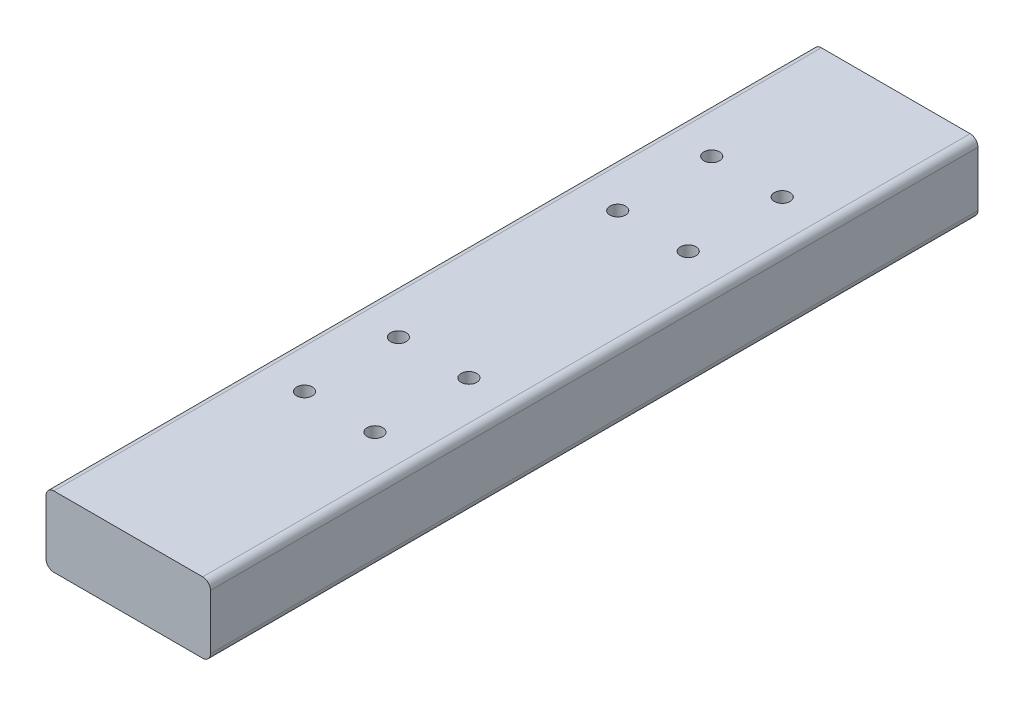
ISO-10303-21;
HEADER;
FILE_DESCRIPTION(('STEP AP214'),'2;1');
FILE_NAME('part.step','',(''),(''),'','','');
FILE_SCHEMA(('AUTOMOTIVE_DESIGN { 1 0 10303 214 1 1 1 1 }'));
ENDSEC;
DATA;
#1=APPLICATION_CONTEXT('core data for automotive mechanical design processes');
#2=APPLICATION_PROTOCOL_DEFINITION('international standard','automotive_design',2000,#1);
#3=PRODUCT_CONTEXT('',#1,'mechanical');
#4=PRODUCT('Part','Part','',(#3));
#5=PRODUCT_RELATED_PRODUCT_CATEGORY('part','',(#4));
#6=PRODUCT_DEFINITION_FORMATION('','',#4);
#7=PRODUCT_DEFINITION_CONTEXT('part definition',#1,'design');
#8=PRODUCT_DEFINITION('design','',#6,#7);
#9=PRODUCT_DEFINITION_SHAPE('','',#8);
#10=(LENGTH_UNIT() NAMED_UNIT(*) SI_UNIT(.MILLI.,.METRE.));
#11=(NAMED_UNIT(*) PLANE_ANGLE_UNIT() SI_UNIT($,.RADIAN.));
#12=(NAMED_UNIT(*) SI_UNIT($,.STERADIAN.) SOLID_ANGLE_UNIT());
#13=UNCERTAINTY_MEASURE_WITH_UNIT(LENGTH_MEASURE(1.E-05),#10,'distance_accuracy_value','');
#14=(GEOMETRIC_REPRESENTATION_CONTEXT(3) GLOBAL_UNCERTAINTY_ASSIGNED_CONTEXT((#13)) GLOBAL_UNIT_ASSIGNED_CONTEXT((#10,
#11,#12)) REPRESENTATION_CONTEXT('',''));
#15=CARTESIAN_POINT('',(0.,0.,0.));
#16=DIRECTION('',(0.,0.,1.));
#17=DIRECTION('',(1.,0.,0.));
#18=AXIS2_PLACEMENT_3D('',#15,#16,#17);
#19=CARTESIAN_POINT('',(0.,0.,196.));
#20=DIRECTION('',(1.,0.,0.));
#21=DIRECTION('',(0.,0.,-1.));
#22=AXIS2_PLACEMENT_3D('',#19,#20,#21);
#23=PLANE('',#22);
#24=DIRECTION('',(0.,-1.,0.));
#25=VECTOR('',#24,1.);
#26=CARTESIAN_POINT('',(0.,0.,0.));
#27=LINE('',#26,#25);
#28=CARTESIAN_POINT('',(0.,16.,0.));
#29=VERTEX_POINT('',#28);
#30=CARTESIAN_POINT('',(0.,2.,0.));
#31=VERTEX_POINT('',#30);
#32=EDGE_CURVE('E126',#29,#31,#27,.T.);
#33=ORIENTED_EDGE('',*,*,#32,.T.);
#34=DIRECTION('',(0.,0.,-1.));
#35=VECTOR('',#34,1.);
#36=CARTESIAN_POINT('',(0.,2.,196.));
#37=LINE('',#36,#35);
#38=CARTESIAN_POINT('',(0.,2.,196.));
#39=VERTEX_POINT('',#38);
#40=EDGE_CURVE('E104',#31,#39,#37,.F.);
#41=ORIENTED_EDGE('',*,*,#40,.T.);
#42=DIRECTION('',(0.,-1.,0.));
#43=VECTOR('',#42,1.);
#44=CARTESIAN_POINT('',(0.,0.,196.));
#45=LINE('',#44,#43);
#46=CARTESIAN_POINT('',(0.,16.,196.));
#47=VERTEX_POINT('',#46);
#48=EDGE_CURVE('E136',#47,#39,#45,.T.);
#49=ORIENTED_EDGE('',*,*,#48,.F.);
#50=DIRECTION('',(0.,0.,-1.));
#51=VECTOR('',#50,1.);
#52=CARTESIAN_POINT('',(0.,16.,196.));
#53=LINE('',#52,#51);
#54=EDGE_CURVE('E109',#47,#29,#53,.T.);
#55=ORIENTED_EDGE('',*,*,#54,.T.);
#56=EDGE_LOOP('',(#33,#41,#49,#55));
#57=FACE_BOUND('',#56,.T.);
#58=ADVANCED_FACE('F33',(#57),#23,.F.);
#59=CARTESIAN_POINT('',(0.,0.,196.));
#60=DIRECTION('',(0.,1.,0.));
#61=DIRECTION('',(0.,0.,1.));
#62=AXIS2_PLACEMENT_3D('',#59,#60,#61);
#63=PLANE('',#62);
#64=CARTESIAN_POINT('',(12.,0.,38.));
#65=DIRECTION('',(0.,-1.,0.));
#66=DIRECTION('',(0.,0.,-1.));
#67=AXIS2_PLACEMENT_3D('',#64,#65,#66);
#68=CIRCLE('',#67,2.);
#69=CARTESIAN_POINT('',(12.,0.,36.));
#70=VERTEX_POINT('',#69);
#71=EDGE_CURVE('E218',#70,#70,#68,.T.);
#72=ORIENTED_EDGE('',*,*,#71,.F.);
#73=EDGE_LOOP('',(#72));
#74=FACE_BOUND('',#73,.T.);
#75=CARTESIAN_POINT('',(30.,0.,38.));
#76=DIRECTION('',(0.,-1.,0.));
#77=DIRECTION('',(0.,0.,-1.));
#78=AXIS2_PLACEMENT_3D('',#75,#76,#77);
#79=CIRCLE('',#78,2.);
#80=CARTESIAN_POINT('',(30.,0.,36.));
#81=VERTEX_POINT('',#80);
#82=EDGE_CURVE('E212',#81,#81,#79,.T.);
#83=ORIENTED_EDGE('',*,*,#82,.F.);
#84=EDGE_LOOP('',(#83));
#85=FACE_BOUND('',#84,.T.);
#86=CARTESIAN_POINT('',(30.,0.,62.));
#87=DIRECTION('',(0.,-1.,0.));
#88=DIRECTION('',(0.,0.,-1.));
#89=AXIS2_PLACEMENT_3D('',#86,#87,#88);
#90=CIRCLE('',#89,2.);
#91=CARTESIAN_POINT('',(30.,0.,60.));
#92=VERTEX_POINT('',#91);
#93=EDGE_CURVE('E206',#92,#92,#90,.T.);
#94=ORIENTED_EDGE('',*,*,#93,.F.);
#95=EDGE_LOOP('',(#94));
#96=FACE_BOUND('',#95,.T.);
#97=CARTESIAN_POINT('',(12.,0.,62.));
#98=DIRECTION('',(0.,-1.,0.));
#99=DIRECTION('',(0.,0.,-1.));
#100=AXIS2_PLACEMENT_3D('',#97,#98,#99);
#101=CIRCLE('',#100,2.);
#102=CARTESIAN_POINT('',(12.,0.,60.));
#103=VERTEX_POINT('',#102);
#104=EDGE_CURVE('E200',#103,#103,#101,.T.);
#105=ORIENTED_EDGE('',*,*,#104,.F.);
#106=EDGE_LOOP('',(#105));
#107=FACE_BOUND('',#106,.T.);
#108=CARTESIAN_POINT('',(30.,0.,118.));
#109=DIRECTION('',(0.,-1.,0.));
#110=DIRECTION('',(0.,0.,-1.));
#111=AXIS2_PLACEMENT_3D('',#108,#109,#110);
#112=CIRCLE('',#111,2.00000000000001);
#113=CARTESIAN_POINT('',(30.,0.,116.));
#114=VERTEX_POINT('',#113);
#115=EDGE_CURVE('E194',#114,#114,#112,.T.);
#116=ORIENTED_EDGE('',*,*,#115,.F.);
#117=EDGE_LOOP('',(#116));
#118=FACE_BOUND('',#117,.T.);
#119=CARTESIAN_POINT('',(12.,0.,118.));
#120=DIRECTION('',(0.,-1.,0.));
#121=DIRECTION('',(0.,0.,-1.));
#122=AXIS2_PLACEMENT_3D('',#119,#120,#121);
#123=CIRCLE('',#122,2.);
#124=CARTESIAN_POINT('',(12.,0.,116.));
#125=VERTEX_POINT('',#124);
#126=EDGE_CURVE('E188',#125,#125,#123,.T.);
#127=ORIENTED_EDGE('',*,*,#126,.F.);
#128=EDGE_LOOP('',(#127));
#129=FACE_BOUND('',#128,.T.);
#130=CARTESIAN_POINT('',(30.,0.,142.));
#131=DIRECTION('',(0.,-1.,0.));
#132=DIRECTION('',(0.,0.,-1.));
#133=AXIS2_PLACEMENT_3D('',#130,#131,#132);
#134=CIRCLE('',#133,2.00000000000001);
#135=CARTESIAN_POINT('',(30.,0.,140.));
#136=VERTEX_POINT('',#135);
#137=EDGE_CURVE('E182',#136,#136,#134,.T.);
#138=ORIENTED_EDGE('',*,*,#137,.F.);
#139=EDGE_LOOP('',(#138));
#140=FACE_BOUND('',#139,.T.);
#141=CARTESIAN_POINT('',(12.,0.,142.));
#142=DIRECTION('',(0.,-1.,0.));
#143=DIRECTION('',(0.,0.,-1.));
#144=AXIS2_PLACEMENT_3D('',#141,#142,#143);
#145=CIRCLE('',#144,2.);
#146=CARTESIAN_POINT('',(12.,0.,140.));
#147=VERTEX_POINT('',#146);
#148=EDGE_CURVE('E176',#147,#147,#145,.T.);
#149=ORIENTED_EDGE('',*,*,#148,.F.);
#150=EDGE_LOOP('',(#149));
#151=FACE_BOUND('',#150,.T.);
#152=DIRECTION('',(1.,0.,0.));
#153=VECTOR('',#152,1.);
#154=CARTESIAN_POINT('',(0.,0.,196.));
#155=LINE('',#154,#153);
#156=CARTESIAN_POINT('',(2.,0.,196.));
#157=VERTEX_POINT('',#156);
#158=CARTESIAN_POINT('',(40.,0.,196.));
#159=VERTEX_POINT('',#158);
#160=EDGE_CURVE('E119',#157,#159,#155,.T.);
#161=ORIENTED_EDGE('',*,*,#160,.F.);
#162=DIRECTION('',(0.,0.,-1.));
#163=VECTOR('',#162,1.);
#164=CARTESIAN_POINT('',(2.,0.,196.));
#165=LINE('',#164,#163);
#166=CARTESIAN_POINT('',(2.,0.,0.));
#167=VERTEX_POINT('',#166);
#168=EDGE_CURVE('E103',#157,#167,#165,.T.);
#169=ORIENTED_EDGE('',*,*,#168,.T.);
#170=DIRECTION('',(1.,0.,0.));
#171=VECTOR('',#170,1.);
#172=CARTESIAN_POINT('',(0.,0.,0.));
#173=LINE('',#172,#171);
#174=CARTESIAN_POINT('',(40.,0.,0.));
#175=VERTEX_POINT('',#174);
#176=EDGE_CURVE('E116',#167,#175,#173,.T.);
#177=ORIENTED_EDGE('',*,*,#176,.T.);
#178=DIRECTION('',(0.,0.,-1.));
#179=VECTOR('',#178,1.);
#180=CARTESIAN_POINT('',(40.,0.,196.));
#181=LINE('',#180,#179);
#182=EDGE_CURVE('E121',#175,#159,#181,.F.);
#183=ORIENTED_EDGE('',*,*,#182,.T.);
#184=EDGE_LOOP('',(#161,#169,#177,#183));
#185=FACE_BOUND('',#184,.T.);
#186=ADVANCED_FACE('F115',(#74,#85,#96,#107,#118,#129,#140,#151,#185),#63,.F.);
#187=CARTESIAN_POINT('',(42.,0.,196.));
#188=DIRECTION('',(-1.,0.,0.));
#189=DIRECTION('',(0.,0.,1.));
#190=AXIS2_PLACEMENT_3D('',#187,#188,#189);
#191=PLANE('',#190);
#192=DIRECTION('',(0.,1.,0.));
#193=VECTOR('',#192,1.);
#194=CARTESIAN_POINT('',(42.,0.,196.));
#195=LINE('',#194,#193);
#196=CARTESIAN_POINT('',(42.,2.,196.));
#197=VERTEX_POINT('',#196);
#198=CARTESIAN_POINT('',(42.,16.,196.));
#199=VERTEX_POINT('',#198);
#200=EDGE_CURVE('E162',#197,#199,#195,.T.);
#201=ORIENTED_EDGE('',*,*,#200,.F.);
#202=DIRECTION('',(0.,0.,-1.));
#203=VECTOR('',#202,1.);
#204=CARTESIAN_POINT('',(42.,2.,196.));
#205=LINE('',#204,#203);
#206=CARTESIAN_POINT('',(42.,2.,0.));
#207=VERTEX_POINT('',#206);
#208=EDGE_CURVE('E155',#197,#207,#205,.T.);
#209=ORIENTED_EDGE('',*,*,#208,.T.);
#210=DIRECTION('',(0.,1.,0.));
#211=VECTOR('',#210,1.);
#212=CARTESIAN_POINT('',(42.,0.,0.));
#213=LINE('',#212,#211);
#214=CARTESIAN_POINT('',(42.,16.,0.));
#215=VERTEX_POINT('',#214);
#216=EDGE_CURVE('E125',#207,#215,#213,.T.);
#217=ORIENTED_EDGE('',*,*,#216,.T.);
#218=DIRECTION('',(0.,0.,-1.));
#219=VECTOR('',#218,1.);
#220=CARTESIAN_POINT('',(42.,16.,196.));
#221=LINE('',#220,#219);
#222=EDGE_CURVE('E153',#215,#199,#221,.F.);
#223=ORIENTED_EDGE('',*,*,#222,.T.);
#224=EDGE_LOOP('',(#201,#209,#217,#223));
#225=FACE_BOUND('',#224,.T.);
#226=ADVANCED_FACE('F160',(#225),#191,.F.);
#227=CARTESIAN_POINT('',(0.,18.,196.));
#228=DIRECTION('',(0.,-1.,0.));
#229=DIRECTION('',(0.,0.,-1.));
#230=AXIS2_PLACEMENT_3D('',#227,#228,#229);
#231=PLANE('',#230);
#232=CARTESIAN_POINT('',(12.,18.,38.));
#233=DIRECTION('',(0.,-1.,0.));
#234=DIRECTION('',(0.,0.,-1.));
#235=AXIS2_PLACEMENT_3D('',#232,#233,#234);
#236=CIRCLE('',#235,2.);
#237=CARTESIAN_POINT('',(12.,18.,36.));
#238=VERTEX_POINT('',#237);
#239=EDGE_CURVE('E215',#238,#238,#236,.T.);
#240=ORIENTED_EDGE('',*,*,#239,.T.);
#241=EDGE_LOOP('',(#240));
#242=FACE_BOUND('',#241,.T.);
#243=CARTESIAN_POINT('',(30.,18.,38.));
#244=DIRECTION('',(0.,-1.,0.));
#245=DIRECTION('',(0.,0.,-1.));
#246=AXIS2_PLACEMENT_3D('',#243,#244,#245);
#247=CIRCLE('',#246,2.);
#248=CARTESIAN_POINT('',(30.,18.,36.));
#249=VERTEX_POINT('',#248);
#250=EDGE_CURVE('E209',#249,#249,#247,.T.);
#251=ORIENTED_EDGE('',*,*,#250,.T.);
#252=EDGE_LOOP('',(#251));
#253=FACE_BOUND('',#252,.T.);
#254=CARTESIAN_POINT('',(30.,18.,62.));
#255=DIRECTION('',(0.,-1.,0.));
#256=DIRECTION('',(0.,0.,-1.));
#257=AXIS2_PLACEMENT_3D('',#254,#255,#256);
#258=CIRCLE('',#257,2.);
#259=CARTESIAN_POINT('',(30.,18.,60.));
#260=VERTEX_POINT('',#259);
#261=EDGE_CURVE('E203',#260,#260,#258,.T.);
#262=ORIENTED_EDGE('',*,*,#261,.T.);
#263=EDGE_LOOP('',(#262));
#264=FACE_BOUND('',#263,.T.);
#265=CARTESIAN_POINT('',(12.,18.,62.));
#266=DIRECTION('',(0.,-1.,0.));
#267=DIRECTION('',(0.,0.,-1.));
#268=AXIS2_PLACEMENT_3D('',#265,#266,#267);
#269=CIRCLE('',#268,2.);
#270=CARTESIAN_POINT('',(12.,18.,60.));
#271=VERTEX_POINT('',#270);
#272=EDGE_CURVE('E197',#271,#271,#269,.T.);
#273=ORIENTED_EDGE('',*,*,#272,.T.);
#274=EDGE_LOOP('',(#273));
#275=FACE_BOUND('',#274,.T.);
#276=CARTESIAN_POINT('',(30.,18.,118.));
#277=DIRECTION('',(0.,-1.,0.));
#278=DIRECTION('',(0.,0.,-1.));
#279=AXIS2_PLACEMENT_3D('',#276,#277,#278);
#280=CIRCLE('',#279,2.00000000000001);
#281=CARTESIAN_POINT('',(30.,18.,116.));
#282=VERTEX_POINT('',#281);
#283=EDGE_CURVE('E191',#282,#282,#280,.T.);
#284=ORIENTED_EDGE('',*,*,#283,.T.);
#285=EDGE_LOOP('',(#284));
#286=FACE_BOUND('',#285,.T.);
#287=CARTESIAN_POINT('',(12.,18.,118.));
#288=DIRECTION('',(0.,-1.,0.));
#289=DIRECTION('',(0.,0.,-1.));
#290=AXIS2_PLACEMENT_3D('',#287,#288,#289);
#291=CIRCLE('',#290,2.);
#292=CARTESIAN_POINT('',(12.,18.,116.));
#293=VERTEX_POINT('',#292);
#294=EDGE_CURVE('E185',#293,#293,#291,.T.);
#295=ORIENTED_EDGE('',*,*,#294,.T.);
#296=EDGE_LOOP('',(#295));
#297=FACE_BOUND('',#296,.T.);
#298=CARTESIAN_POINT('',(30.,18.,142.));
#299=DIRECTION('',(0.,-1.,0.));
#300=DIRECTION('',(0.,0.,-1.));
#301=AXIS2_PLACEMENT_3D('',#298,#299,#300);
#302=CIRCLE('',#301,2.00000000000001);
#303=CARTESIAN_POINT('',(30.,18.,140.));
#304=VERTEX_POINT('',#303);
#305=EDGE_CURVE('E179',#304,#304,#302,.T.);
#306=ORIENTED_EDGE('',*,*,#305,.T.);
#307=EDGE_LOOP('',(#306));
#308=FACE_BOUND('',#307,.T.);
#309=CARTESIAN_POINT('',(12.,18.,142.));
#310=DIRECTION('',(0.,-1.,0.));
#311=DIRECTION('',(0.,0.,-1.));
#312=AXIS2_PLACEMENT_3D('',#309,#310,#311);
#313=CIRCLE('',#312,2.);
#314=CARTESIAN_POINT('',(12.,18.,140.));
#315=VERTEX_POINT('',#314);
#316=EDGE_CURVE('E131',#315,#315,#313,.T.);
#317=ORIENTED_EDGE('',*,*,#316,.T.);
#318=EDGE_LOOP('',(#317));
#319=FACE_BOUND('',#318,.T.);
#320=DIRECTION('',(-1.,0.,0.));
#321=VECTOR('',#320,1.);
#322=CARTESIAN_POINT('',(0.,18.,196.));
#323=LINE('',#322,#321);
#324=CARTESIAN_POINT('',(40.,18.,196.));
#325=VERTEX_POINT('',#324);
#326=CARTESIAN_POINT('',(2.,18.,196.));
#327=VERTEX_POINT('',#326);
#328=EDGE_CURVE('E137',#325,#327,#323,.T.);
#329=ORIENTED_EDGE('',*,*,#328,.F.);
#330=DIRECTION('',(0.,0.,-1.));
#331=VECTOR('',#330,1.);
#332=CARTESIAN_POINT('',(40.,18.,196.));
#333=LINE('',#332,#331);
#334=CARTESIAN_POINT('',(40.,18.,0.));
#335=VERTEX_POINT('',#334);
#336=EDGE_CURVE('E11',#325,#335,#333,.T.);
#337=ORIENTED_EDGE('',*,*,#336,.T.);
#338=DIRECTION('',(-1.,0.,0.));
#339=VECTOR('',#338,1.);
#340=CARTESIAN_POINT('',(0.,18.,0.));
#341=LINE('',#340,#339);
#342=CARTESIAN_POINT('',(2.,18.,0.));
#343=VERTEX_POINT('',#342);
#344=EDGE_CURVE('E129',#335,#343,#341,.T.);
#345=ORIENTED_EDGE('',*,*,#344,.T.);
#346=DIRECTION('',(0.,0.,-1.));
#347=VECTOR('',#346,1.);
#348=CARTESIAN_POINT('',(2.,18.,196.));
#349=LINE('',#348,#347);
#350=EDGE_CURVE('E41',#343,#327,#349,.F.);
#351=ORIENTED_EDGE('',*,*,#350,.T.);
#352=EDGE_LOOP('',(#329,#337,#345,#351));
#353=FACE_BOUND('',#352,.T.);
#354=ADVANCED_FACE('F169',(#242,#253,#264,#275,#286,#297,#308,#319,#353),#231,.F.);
#355=CARTESIAN_POINT('',(0.,0.,196.));
#356=DIRECTION('',(0.,0.,-1.));
#357=DIRECTION('',(-1.,0.,0.));
#358=AXIS2_PLACEMENT_3D('',#355,#356,#357);
#359=PLANE('',#358);
#360=ORIENTED_EDGE('',*,*,#48,.T.);
#361=CARTESIAN_POINT('',(2.,2.,196.));
#362=DIRECTION('',(0.,0.,-1.));
#363=DIRECTION('',(-1.,0.,0.));
#364=AXIS2_PLACEMENT_3D('',#361,#362,#363);
#365=CIRCLE('',#364,2.);
#366=EDGE_CURVE('E151',#39,#157,#365,.F.);
#367=ORIENTED_EDGE('',*,*,#366,.T.);
#368=ORIENTED_EDGE('',*,*,#160,.T.);
#369=CARTESIAN_POINT('',(40.,2.,196.));
#370=DIRECTION('',(0.,0.,-1.));
#371=DIRECTION('',(-1.,0.,0.));
#372=AXIS2_PLACEMENT_3D('',#369,#370,#371);
#373=CIRCLE('',#372,2.);
#374=EDGE_CURVE('E149',#159,#197,#373,.F.);
#375=ORIENTED_EDGE('',*,*,#374,.T.);
#376=ORIENTED_EDGE('',*,*,#200,.T.);
#377=CARTESIAN_POINT('',(40.,16.,196.));
#378=DIRECTION('',(0.,0.,-1.));
#379=DIRECTION('',(-1.,0.,0.));
#380=AXIS2_PLACEMENT_3D('',#377,#378,#379);
#381=CIRCLE('',#380,2.);
#382=EDGE_CURVE('E54',#199,#325,#381,.F.);
#383=ORIENTED_EDGE('',*,*,#382,.T.);
#384=ORIENTED_EDGE('',*,*,#328,.T.);
#385=CARTESIAN_POINT('',(2.,16.,196.));
#386=DIRECTION('',(0.,0.,-1.));
#387=DIRECTION('',(-1.,0.,0.));
#388=AXIS2_PLACEMENT_3D('',#385,#386,#387);
#389=CIRCLE('',#388,2.);
#390=EDGE_CURVE('E146',#327,#47,#389,.F.);
#391=ORIENTED_EDGE('',*,*,#390,.T.);
#392=EDGE_LOOP('',(#360,#367,#368,#375,#376,#383,#384,#391));
#393=FACE_BOUND('',#392,.T.);
#394=ADVANCED_FACE('F298',(#393),#359,.F.);
#395=CARTESIAN_POINT('',(0.,0.,0.));
#396=DIRECTION('',(0.,0.,-1.));
#397=DIRECTION('',(-1.,0.,0.));
#398=AXIS2_PLACEMENT_3D('',#395,#396,#397);
#399=PLANE('',#398);
#400=ORIENTED_EDGE('',*,*,#176,.F.);
#401=CARTESIAN_POINT('',(2.,2.,0.));
#402=DIRECTION('',(0.,0.,-1.));
#403=DIRECTION('',(-1.,0.,0.));
#404=AXIS2_PLACEMENT_3D('',#401,#402,#403);
#405=CIRCLE('',#404,2.);
#406=EDGE_CURVE('E99',#167,#31,#405,.T.);
#407=ORIENTED_EDGE('',*,*,#406,.T.);
#408=ORIENTED_EDGE('',*,*,#32,.F.);
#409=CARTESIAN_POINT('',(2.,16.,0.));
#410=DIRECTION('',(0.,0.,-1.));
#411=DIRECTION('',(-1.,0.,0.));
#412=AXIS2_PLACEMENT_3D('',#409,#410,#411);
#413=CIRCLE('',#412,2.);
#414=EDGE_CURVE('E120',#29,#343,#413,.T.);
#415=ORIENTED_EDGE('',*,*,#414,.T.);
#416=ORIENTED_EDGE('',*,*,#344,.F.);
#417=CARTESIAN_POINT('',(40.,16.,0.));
#418=DIRECTION('',(0.,0.,-1.));
#419=DIRECTION('',(-1.,0.,0.));
#420=AXIS2_PLACEMENT_3D('',#417,#418,#419);
#421=CIRCLE('',#420,2.);
#422=EDGE_CURVE('E140',#335,#215,#421,.T.);
#423=ORIENTED_EDGE('',*,*,#422,.T.);
#424=ORIENTED_EDGE('',*,*,#216,.F.);
#425=CARTESIAN_POINT('',(40.,2.,0.));
#426=DIRECTION('',(0.,0.,-1.));
#427=DIRECTION('',(-1.,0.,0.));
#428=AXIS2_PLACEMENT_3D('',#425,#426,#427);
#429=CIRCLE('',#428,2.);
#430=EDGE_CURVE('E110',#207,#175,#429,.T.);
#431=ORIENTED_EDGE('',*,*,#430,.T.);
#432=EDGE_LOOP('',(#400,#407,#408,#415,#416,#423,#424,#431));
#433=FACE_BOUND('',#432,.T.);
#434=ADVANCED_FACE('F123',(#433),#399,.T.);
#435=CARTESIAN_POINT('',(2.,2.,196.));
#436=DIRECTION('',(0.,0.,-1.));
#437=DIRECTION('',(-1.,0.,0.));
#438=AXIS2_PLACEMENT_3D('',#435,#436,#437);
#439=CYLINDRICAL_SURFACE('',#438,2.);
#440=ORIENTED_EDGE('',*,*,#366,.F.);
#441=ORIENTED_EDGE('',*,*,#40,.F.);
#442=ORIENTED_EDGE('',*,*,#406,.F.);
#443=ORIENTED_EDGE('',*,*,#168,.F.);
#444=EDGE_LOOP('',(#440,#441,#442,#443));
#445=FACE_BOUND('',#444,.T.);
#446=ADVANCED_FACE('F102',(#445),#439,.T.);
#447=CARTESIAN_POINT('',(40.,2.,196.));
#448=DIRECTION('',(0.,0.,-1.));
#449=DIRECTION('',(-1.,0.,0.));
#450=AXIS2_PLACEMENT_3D('',#447,#448,#449);
#451=CYLINDRICAL_SURFACE('',#450,2.);
#452=ORIENTED_EDGE('',*,*,#374,.F.);
#453=ORIENTED_EDGE('',*,*,#182,.F.);
#454=ORIENTED_EDGE('',*,*,#430,.F.);
#455=ORIENTED_EDGE('',*,*,#208,.F.);
#456=EDGE_LOOP('',(#452,#453,#454,#455));
#457=FACE_BOUND('',#456,.T.);
#458=ADVANCED_FACE('F275',(#457),#451,.T.);
#459=CARTESIAN_POINT('',(40.,16.,196.));
#460=DIRECTION('',(0.,0.,-1.));
#461=DIRECTION('',(-1.,0.,0.));
#462=AXIS2_PLACEMENT_3D('',#459,#460,#461);
#463=CYLINDRICAL_SURFACE('',#462,2.);
#464=ORIENTED_EDGE('',*,*,#382,.F.);
#465=ORIENTED_EDGE('',*,*,#222,.F.);
#466=ORIENTED_EDGE('',*,*,#422,.F.);
#467=ORIENTED_EDGE('',*,*,#336,.F.);
#468=EDGE_LOOP('',(#464,#465,#466,#467));
#469=FACE_BOUND('',#468,.T.);
#470=ADVANCED_FACE('F168',(#469),#463,.T.);
#471=CARTESIAN_POINT('',(2.,16.,196.));
#472=DIRECTION('',(0.,0.,-1.));
#473=DIRECTION('',(-1.,0.,0.));
#474=AXIS2_PLACEMENT_3D('',#471,#472,#473);
#475=CYLINDRICAL_SURFACE('',#474,2.);
#476=ORIENTED_EDGE('',*,*,#390,.F.);
#477=ORIENTED_EDGE('',*,*,#350,.F.);
#478=ORIENTED_EDGE('',*,*,#414,.F.);
#479=ORIENTED_EDGE('',*,*,#54,.F.);
#480=EDGE_LOOP('',(#476,#477,#478,#479));
#481=FACE_BOUND('',#480,.T.);
#482=ADVANCED_FACE('F35',(#481),#475,.T.);
#483=CARTESIAN_POINT('',(12.,18.,142.));
#484=DIRECTION('',(0.,-1.,0.));
#485=DIRECTION('',(0.,0.,-1.));
#486=AXIS2_PLACEMENT_3D('',#483,#484,#485);
#487=CYLINDRICAL_SURFACE('',#486,2.);
#488=ORIENTED_EDGE('',*,*,#316,.F.);
#489=EDGE_LOOP('',(#488));
#490=FACE_BOUND('',#489,.T.);
#491=ORIENTED_EDGE('',*,*,#148,.T.);
#492=EDGE_LOOP('',(#491));
#493=FACE_BOUND('',#492,.T.);
#494=ADVANCED_FACE('F250',(#490,#493),#487,.F.);
#495=CARTESIAN_POINT('',(30.,18.,142.));
#496=DIRECTION('',(0.,-1.,0.));
#497=DIRECTION('',(0.,0.,-1.));
#498=AXIS2_PLACEMENT_3D('',#495,#496,#497);
#499=CYLINDRICAL_SURFACE('',#498,2.00000000000001);
#500=ORIENTED_EDGE('',*,*,#305,.F.);
#501=EDGE_LOOP('',(#500));
#502=FACE_BOUND('',#501,.T.);
#503=ORIENTED_EDGE('',*,*,#137,.T.);
#504=EDGE_LOOP('',(#503));
#505=FACE_BOUND('',#504,.T.);
#506=ADVANCED_FACE('F252',(#502,#505),#499,.F.);
#507=CARTESIAN_POINT('',(12.,18.,118.));
#508=DIRECTION('',(0.,-1.,0.));
#509=DIRECTION('',(0.,0.,-1.));
#510=AXIS2_PLACEMENT_3D('',#507,#508,#509);
#511=CYLINDRICAL_SURFACE('',#510,2.);
#512=ORIENTED_EDGE('',*,*,#294,.F.);
#513=EDGE_LOOP('',(#512));
#514=FACE_BOUND('',#513,.T.);
#515=ORIENTED_EDGE('',*,*,#126,.T.);
#516=EDGE_LOOP('',(#515));
#517=FACE_BOUND('',#516,.T.);
#518=ADVANCED_FACE('F259',(#514,#517),#511,.F.);
#519=CARTESIAN_POINT('',(30.,18.,118.));
#520=DIRECTION('',(0.,-1.,0.));
#521=DIRECTION('',(0.,0.,-1.));
#522=AXIS2_PLACEMENT_3D('',#519,#520,#521);
#523=CYLINDRICAL_SURFACE('',#522,2.00000000000001);
#524=ORIENTED_EDGE('',*,*,#283,.F.);
#525=EDGE_LOOP('',(#524));
#526=FACE_BOUND('',#525,.T.);
#527=ORIENTED_EDGE('',*,*,#115,.T.);
#528=EDGE_LOOP('',(#527));
#529=FACE_BOUND('',#528,.T.);
#530=ADVANCED_FACE('F317',(#526,#529),#523,.F.);
#531=CARTESIAN_POINT('',(12.,18.,62.));
#532=DIRECTION('',(0.,-1.,0.));
#533=DIRECTION('',(0.,0.,-1.));
#534=AXIS2_PLACEMENT_3D('',#531,#532,#533);
#535=CYLINDRICAL_SURFACE('',#534,2.);
#536=ORIENTED_EDGE('',*,*,#272,.F.);
#537=EDGE_LOOP('',(#536));
#538=FACE_BOUND('',#537,.T.);
#539=ORIENTED_EDGE('',*,*,#104,.T.);
#540=EDGE_LOOP('',(#539));
#541=FACE_BOUND('',#540,.T.);
#542=ADVANCED_FACE('F327',(#538,#541),#535,.F.);
#543=CARTESIAN_POINT('',(30.,18.,62.));
#544=DIRECTION('',(0.,-1.,0.));
#545=DIRECTION('',(0.,0.,-1.));
#546=AXIS2_PLACEMENT_3D('',#543,#544,#545);
#547=CYLINDRICAL_SURFACE('',#546,2.);
#548=ORIENTED_EDGE('',*,*,#261,.F.);
#549=EDGE_LOOP('',(#548));
#550=FACE_BOUND('',#549,.T.);
#551=ORIENTED_EDGE('',*,*,#93,.T.);
#552=EDGE_LOOP('',(#551));
#553=FACE_BOUND('',#552,.T.);
#554=ADVANCED_FACE('F337',(#550,#553),#547,.F.);
#555=CARTESIAN_POINT('',(30.,18.,38.));
#556=DIRECTION('',(0.,-1.,0.));
#557=DIRECTION('',(0.,0.,-1.));
#558=AXIS2_PLACEMENT_3D('',#555,#556,#557);
#559=CYLINDRICAL_SURFACE('',#558,2.);
#560=ORIENTED_EDGE('',*,*,#250,.F.);
#561=EDGE_LOOP('',(#560));
#562=FACE_BOUND('',#561,.T.);
#563=ORIENTED_EDGE('',*,*,#82,.T.);
#564=EDGE_LOOP('',(#563));
#565=FACE_BOUND('',#564,.T.);
#566=ADVANCED_FACE('F229',(#562,#565),#559,.F.);
#567=CARTESIAN_POINT('',(12.,18.,38.));
#568=DIRECTION('',(0.,-1.,0.));
#569=DIRECTION('',(0.,0.,-1.));
#570=AXIS2_PLACEMENT_3D('',#567,#568,#569);
#571=CYLINDRICAL_SURFACE('',#570,2.);
#572=ORIENTED_EDGE('',*,*,#239,.F.);
#573=EDGE_LOOP('',(#572));
#574=FACE_BOUND('',#573,.T.);
#575=ORIENTED_EDGE('',*,*,#71,.T.);
#576=EDGE_LOOP('',(#575));
#577=FACE_BOUND('',#576,.T.);
#578=ADVANCED_FACE('F226',(#574,#577),#571,.F.);
#579=CLOSED_SHELL('',(#58,#186,#226,#354,#394,#434,#446,#458,#470,#482,#494,#506,#518,#530,#542,
#554,#566,#578));
#580=MANIFOLD_SOLID_BREP('B2',#579);
#581=ADVANCED_BREP_SHAPE_REPRESENTATION('',(#18,#580),#14);
#582=SHAPE_DEFINITION_REPRESENTATION(#9,#581);
ENDSEC;
END-ISO-10303-21;
